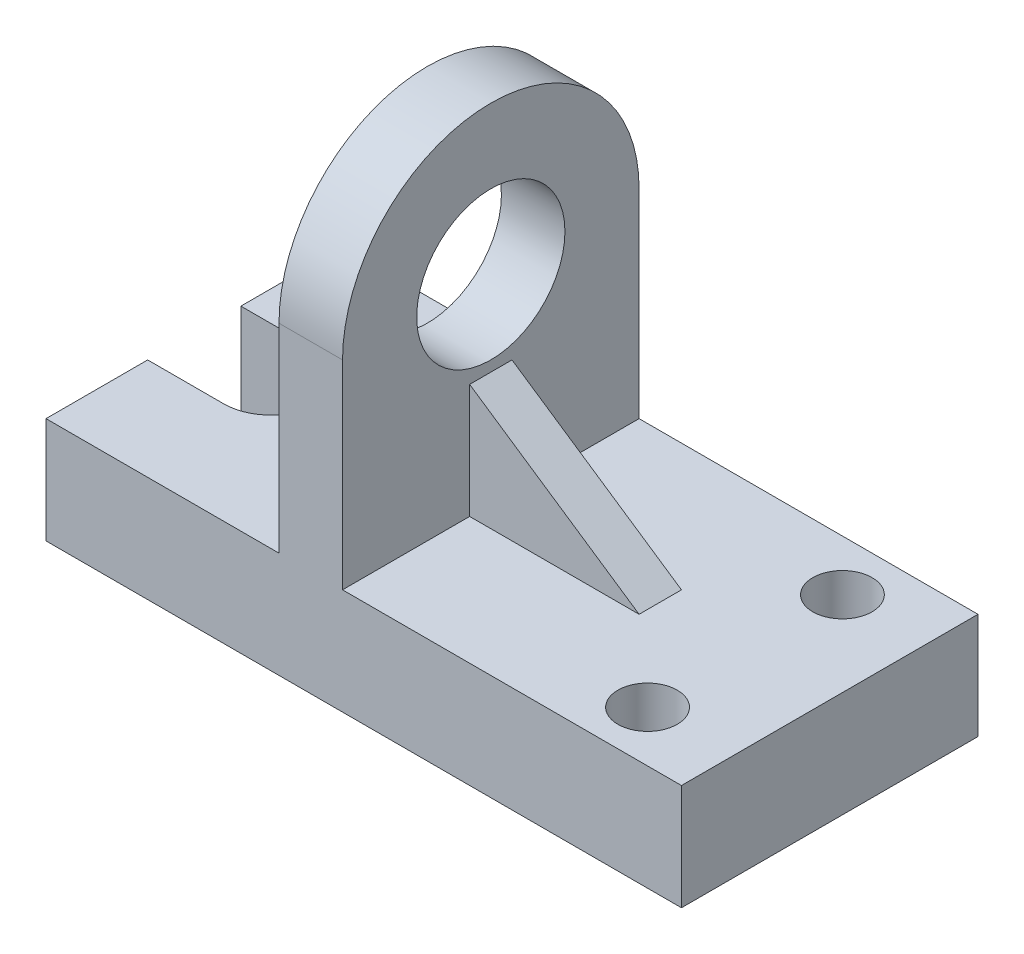
ISO-10303-21;
HEADER;
FILE_DESCRIPTION(('STEP AP214'),'2;1');
FILE_NAME('part.step','',(''),(''),'','','');
FILE_SCHEMA(('AUTOMOTIVE_DESIGN { 1 0 10303 214 1 1 1 1 }'));
ENDSEC;
DATA;
#1=APPLICATION_CONTEXT('core data for automotive mechanical design processes');
#2=APPLICATION_PROTOCOL_DEFINITION('international standard','automotive_design',2000,#1);
#3=PRODUCT_CONTEXT('',#1,'mechanical');
#4=PRODUCT('Part','Part','',(#3));
#5=PRODUCT_RELATED_PRODUCT_CATEGORY('part','',(#4));
#6=PRODUCT_DEFINITION_FORMATION('','',#4);
#7=PRODUCT_DEFINITION_CONTEXT('part definition',#1,'design');
#8=PRODUCT_DEFINITION('design','',#6,#7);
#9=PRODUCT_DEFINITION_SHAPE('','',#8);
#10=(LENGTH_UNIT() NAMED_UNIT(*) SI_UNIT(.MILLI.,.METRE.));
#11=(NAMED_UNIT(*) PLANE_ANGLE_UNIT() SI_UNIT($,.RADIAN.));
#12=(NAMED_UNIT(*) SI_UNIT($,.STERADIAN.) SOLID_ANGLE_UNIT());
#13=UNCERTAINTY_MEASURE_WITH_UNIT(LENGTH_MEASURE(1.E-05),#10,'distance_accuracy_value','');
#14=(GEOMETRIC_REPRESENTATION_CONTEXT(3) GLOBAL_UNCERTAINTY_ASSIGNED_CONTEXT((#13)) GLOBAL_UNIT_ASSIGNED_CONTEXT((#10,
#11,#12)) REPRESENTATION_CONTEXT('',''));
#15=CARTESIAN_POINT('',(0.,0.,0.));
#16=DIRECTION('',(0.,0.,1.));
#17=DIRECTION('',(1.,0.,0.));
#18=AXIS2_PLACEMENT_3D('',#15,#16,#17);
#19=CARTESIAN_POINT('',(0.,0.,70.));
#20=DIRECTION('',(0.,-1.,0.));
#21=DIRECTION('',(0.,0.,-1.));
#22=AXIS2_PLACEMENT_3D('',#19,#20,#21);
#23=PLANE('',#22);
#24=CARTESIAN_POINT('',(130.,0.,58.));
#25=DIRECTION('',(0.,1.,0.));
#26=DIRECTION('',(0.,0.,1.));
#27=AXIS2_PLACEMENT_3D('',#24,#25,#26);
#28=CIRCLE('',#27,7.00000000000002);
#29=CARTESIAN_POINT('',(130.,0.,65.));
#30=VERTEX_POINT('',#29);
#31=EDGE_CURVE('E244',#30,#30,#28,.F.);
#32=ORIENTED_EDGE('',*,*,#31,.T.);
#33=EDGE_LOOP('',(#32));
#34=FACE_BOUND('',#33,.T.);
#35=CARTESIAN_POINT('',(130.,0.,12.));
#36=DIRECTION('',(0.,1.,0.));
#37=DIRECTION('',(0.,0.,1.));
#38=AXIS2_PLACEMENT_3D('',#35,#36,#37);
#39=CIRCLE('',#38,7.00000000000001);
#40=CARTESIAN_POINT('',(130.,0.,19.));
#41=VERTEX_POINT('',#40);
#42=EDGE_CURVE('E251',#41,#41,#39,.T.);
#43=ORIENTED_EDGE('',*,*,#42,.F.);
#44=EDGE_LOOP('',(#43));
#45=FACE_BOUND('',#44,.T.);
#46=DIRECTION('',(0.,0.,-1.));
#47=VECTOR('',#46,1.);
#48=CARTESIAN_POINT('',(70.,0.,0.));
#49=LINE('',#48,#47);
#50=CARTESIAN_POINT('',(70.,0.,30.));
#51=VERTEX_POINT('',#50);
#52=CARTESIAN_POINT('',(70.,0.,0.));
#53=VERTEX_POINT('',#52);
#54=EDGE_CURVE('E38',#51,#53,#49,.T.);
#55=ORIENTED_EDGE('',*,*,#54,.F.);
#56=DIRECTION('',(-1.,0.,0.));
#57=VECTOR('',#56,1.);
#58=CARTESIAN_POINT('',(110.,0.,30.));
#59=LINE('',#58,#57);
#60=CARTESIAN_POINT('',(110.,0.,30.));
#61=VERTEX_POINT('',#60);
#62=EDGE_CURVE('E52',#61,#51,#59,.T.);
#63=ORIENTED_EDGE('',*,*,#62,.F.);
#64=DIRECTION('',(0.,0.,-1.));
#65=VECTOR('',#64,1.);
#66=CARTESIAN_POINT('',(110.,0.,35.));
#67=LINE('',#66,#65);
#68=CARTESIAN_POINT('',(110.,0.,40.));
#69=VERTEX_POINT('',#68);
#70=EDGE_CURVE('E56',#69,#61,#67,.T.);
#71=ORIENTED_EDGE('',*,*,#70,.F.);
#72=DIRECTION('',(-1.,0.,0.));
#73=VECTOR('',#72,1.);
#74=CARTESIAN_POINT('',(110.,0.,40.));
#75=LINE('',#74,#73);
#76=CARTESIAN_POINT('',(70.,0.,40.));
#77=VERTEX_POINT('',#76);
#78=EDGE_CURVE('E154',#69,#77,#75,.T.);
#79=ORIENTED_EDGE('',*,*,#78,.T.);
#80=CARTESIAN_POINT('',(70.,0.,70.));
#81=VERTEX_POINT('',#80);
#82=EDGE_CURVE('E143',#81,#77,#49,.T.);
#83=ORIENTED_EDGE('',*,*,#82,.F.);
#84=DIRECTION('',(-1.,0.,0.));
#85=VECTOR('',#84,1.);
#86=CARTESIAN_POINT('',(0.,0.,70.));
#87=LINE('',#86,#85);
#88=CARTESIAN_POINT('',(150.,0.,70.));
#89=VERTEX_POINT('',#88);
#90=EDGE_CURVE('E235',#89,#81,#87,.T.);
#91=ORIENTED_EDGE('',*,*,#90,.F.);
#92=DIRECTION('',(0.,0.,-1.));
#93=VECTOR('',#92,1.);
#94=CARTESIAN_POINT('',(150.,0.,70.));
#95=LINE('',#94,#93);
#96=CARTESIAN_POINT('',(150.,0.,0.));
#97=VERTEX_POINT('',#96);
#98=EDGE_CURVE('E215',#89,#97,#95,.T.);
#99=ORIENTED_EDGE('',*,*,#98,.T.);
#100=DIRECTION('',(-1.,0.,0.));
#101=VECTOR('',#100,1.);
#102=CARTESIAN_POINT('',(0.,0.,0.));
#103=LINE('',#102,#101);
#104=EDGE_CURVE('E222',#97,#53,#103,.T.);
#105=ORIENTED_EDGE('',*,*,#104,.T.);
#106=EDGE_LOOP('',(#55,#63,#71,#79,#83,#91,#99,#105));
#107=FACE_BOUND('',#106,.T.);
#108=ADVANCED_FACE('F34',(#34,#45,#107),#23,.F.);
#109=CARTESIAN_POINT('',(0.,0.,70.));
#110=DIRECTION('',(1.,0.,0.));
#111=DIRECTION('',(0.,0.,-1.));
#112=AXIS2_PLACEMENT_3D('',#109,#110,#111);
#113=PLANE('',#112);
#114=DIRECTION('',(0.,1.,0.));
#115=VECTOR('',#114,1.);
#116=CARTESIAN_POINT('',(0.,-25.,46.));
#117=LINE('',#116,#115);
#118=CARTESIAN_POINT('',(0.,-25.,46.));
#119=VERTEX_POINT('',#118);
#120=CARTESIAN_POINT('',(0.,0.,46.));
#121=VERTEX_POINT('',#120);
#122=EDGE_CURVE('E265',#119,#121,#117,.T.);
#123=ORIENTED_EDGE('',*,*,#122,.F.);
#124=DIRECTION('',(0.,0.,-1.));
#125=VECTOR('',#124,1.);
#126=CARTESIAN_POINT('',(0.,-25.,70.));
#127=LINE('',#126,#125);
#128=CARTESIAN_POINT('',(0.,-25.,70.));
#129=VERTEX_POINT('',#128);
#130=EDGE_CURVE('E12',#129,#119,#127,.T.);
#131=ORIENTED_EDGE('',*,*,#130,.F.);
#132=DIRECTION('',(0.,-1.,0.));
#133=VECTOR('',#132,1.);
#134=CARTESIAN_POINT('',(0.,0.,70.));
#135=LINE('',#134,#133);
#136=CARTESIAN_POINT('',(0.,0.,70.));
#137=VERTEX_POINT('',#136);
#138=EDGE_CURVE('E225',#137,#129,#135,.T.);
#139=ORIENTED_EDGE('',*,*,#138,.F.);
#140=DIRECTION('',(0.,0.,-1.));
#141=VECTOR('',#140,1.);
#142=CARTESIAN_POINT('',(0.,0.,70.));
#143=LINE('',#142,#141);
#144=EDGE_CURVE('E218',#137,#121,#143,.T.);
#145=ORIENTED_EDGE('',*,*,#144,.T.);
#146=EDGE_LOOP('',(#123,#131,#139,#145));
#147=FACE_BOUND('',#146,.T.);
#148=ADVANCED_FACE('F36',(#147),#113,.F.);
#149=DIRECTION('',(0.,1.,0.));
#150=VECTOR('',#149,1.);
#151=CARTESIAN_POINT('',(0.,-25.,24.));
#152=LINE('',#151,#150);
#153=CARTESIAN_POINT('',(0.,-25.,24.));
#154=VERTEX_POINT('',#153);
#155=CARTESIAN_POINT('',(0.,0.,24.));
#156=VERTEX_POINT('',#155);
#157=EDGE_CURVE('E261',#154,#156,#152,.T.);
#158=ORIENTED_EDGE('',*,*,#157,.T.);
#159=CARTESIAN_POINT('',(0.,0.,0.));
#160=VERTEX_POINT('',#159);
#161=EDGE_CURVE('E221',#156,#160,#143,.T.);
#162=ORIENTED_EDGE('',*,*,#161,.T.);
#163=DIRECTION('',(0.,-1.,0.));
#164=VECTOR('',#163,1.);
#165=CARTESIAN_POINT('',(0.,0.,0.));
#166=LINE('',#165,#164);
#167=CARTESIAN_POINT('',(0.,-25.,0.));
#168=VERTEX_POINT('',#167);
#169=EDGE_CURVE('E231',#160,#168,#166,.T.);
#170=ORIENTED_EDGE('',*,*,#169,.T.);
#171=EDGE_CURVE('E44',#154,#168,#127,.T.);
#172=ORIENTED_EDGE('',*,*,#171,.F.);
#173=EDGE_LOOP('',(#158,#162,#170,#172));
#174=FACE_BOUND('',#173,.T.);
#175=ADVANCED_FACE('F304',(#174),#113,.F.);
#176=CARTESIAN_POINT('',(0.,-25.,70.));
#177=DIRECTION('',(0.,1.,0.));
#178=DIRECTION('',(0.,0.,1.));
#179=AXIS2_PLACEMENT_3D('',#176,#177,#178);
#180=PLANE('',#179);
#181=DIRECTION('',(-1.,0.,0.));
#182=VECTOR('',#181,1.);
#183=CARTESIAN_POINT('',(0.,-25.,46.));
#184=LINE('',#183,#182);
#185=CARTESIAN_POINT('',(18.,-25.,46.));
#186=VERTEX_POINT('',#185);
#187=EDGE_CURVE('E262',#186,#119,#184,.T.);
#188=ORIENTED_EDGE('',*,*,#187,.F.);
#189=CARTESIAN_POINT('',(18.,-25.,35.));
#190=DIRECTION('',(0.,1.,0.));
#191=DIRECTION('',(0.,0.,1.));
#192=AXIS2_PLACEMENT_3D('',#189,#190,#191);
#193=CIRCLE('',#192,11.);
#194=CARTESIAN_POINT('',(18.,-25.,24.));
#195=VERTEX_POINT('',#194);
#196=EDGE_CURVE('E272',#195,#186,#193,.F.);
#197=ORIENTED_EDGE('',*,*,#196,.F.);
#198=DIRECTION('',(1.,0.,0.));
#199=VECTOR('',#198,1.);
#200=CARTESIAN_POINT('',(0.,-25.,24.));
#201=LINE('',#200,#199);
#202=EDGE_CURVE('E279',#154,#195,#201,.T.);
#203=ORIENTED_EDGE('',*,*,#202,.F.);
#204=ORIENTED_EDGE('',*,*,#171,.T.);
#205=DIRECTION('',(1.,0.,0.));
#206=VECTOR('',#205,1.);
#207=CARTESIAN_POINT('',(0.,-25.,0.));
#208=LINE('',#207,#206);
#209=CARTESIAN_POINT('',(150.,-25.,0.));
#210=VERTEX_POINT('',#209);
#211=EDGE_CURVE('E229',#168,#210,#208,.T.);
#212=ORIENTED_EDGE('',*,*,#211,.T.);
#213=DIRECTION('',(0.,0.,-1.));
#214=VECTOR('',#213,1.);
#215=CARTESIAN_POINT('',(150.,-25.,70.));
#216=LINE('',#215,#214);
#217=CARTESIAN_POINT('',(150.,-25.,70.));
#218=VERTEX_POINT('',#217);
#219=EDGE_CURVE('E212',#218,#210,#216,.T.);
#220=ORIENTED_EDGE('',*,*,#219,.F.);
#221=DIRECTION('',(1.,0.,0.));
#222=VECTOR('',#221,1.);
#223=CARTESIAN_POINT('',(0.,-25.,70.));
#224=LINE('',#223,#222);
#225=EDGE_CURVE('E240',#129,#218,#224,.T.);
#226=ORIENTED_EDGE('',*,*,#225,.F.);
#227=ORIENTED_EDGE('',*,*,#130,.T.);
#228=EDGE_LOOP('',(#188,#197,#203,#204,#212,#220,#226,#227));
#229=FACE_BOUND('',#228,.T.);
#230=CARTESIAN_POINT('',(130.,-25.,58.));
#231=DIRECTION('',(0.,1.,0.));
#232=DIRECTION('',(0.,0.,1.));
#233=AXIS2_PLACEMENT_3D('',#230,#231,#232);
#234=CIRCLE('',#233,7.00000000000002);
#235=CARTESIAN_POINT('',(130.,-25.,65.));
#236=VERTEX_POINT('',#235);
#237=EDGE_CURVE('E247',#236,#236,#234,.F.);
#238=ORIENTED_EDGE('',*,*,#237,.F.);
#239=EDGE_LOOP('',(#238));
#240=FACE_BOUND('',#239,.T.);
#241=CARTESIAN_POINT('',(130.,-25.,12.));
#242=DIRECTION('',(0.,1.,0.));
#243=DIRECTION('',(0.,0.,1.));
#244=AXIS2_PLACEMENT_3D('',#241,#242,#243);
#245=CIRCLE('',#244,7.00000000000001);
#246=CARTESIAN_POINT('',(130.,-25.,19.));
#247=VERTEX_POINT('',#246);
#248=EDGE_CURVE('E254',#247,#247,#245,.T.);
#249=ORIENTED_EDGE('',*,*,#248,.T.);
#250=EDGE_LOOP('',(#249));
#251=FACE_BOUND('',#250,.T.);
#252=ADVANCED_FACE('F320',(#229,#240,#251),#180,.F.);
#253=CARTESIAN_POINT('',(55.,0.,70.));
#254=VERTEX_POINT('',#253);
#255=EDGE_CURVE('E237',#254,#137,#87,.T.);
#256=ORIENTED_EDGE('',*,*,#255,.F.);
#257=DIRECTION('',(0.,0.,-1.));
#258=VECTOR('',#257,1.);
#259=CARTESIAN_POINT('',(55.,0.,0.));
#260=LINE('',#259,#258);
#261=CARTESIAN_POINT('',(55.,0.,0.));
#262=VERTEX_POINT('',#261);
#263=EDGE_CURVE('E195',#254,#262,#260,.T.);
#264=ORIENTED_EDGE('',*,*,#263,.T.);
#265=EDGE_CURVE('E226',#262,#160,#103,.T.);
#266=ORIENTED_EDGE('',*,*,#265,.T.);
#267=ORIENTED_EDGE('',*,*,#161,.F.);
#268=DIRECTION('',(1.,0.,0.));
#269=VECTOR('',#268,1.);
#270=CARTESIAN_POINT('',(0.,0.,24.));
#271=LINE('',#270,#269);
#272=CARTESIAN_POINT('',(18.,0.,24.));
#273=VERTEX_POINT('',#272);
#274=EDGE_CURVE('E273',#156,#273,#271,.T.);
#275=ORIENTED_EDGE('',*,*,#274,.T.);
#276=CARTESIAN_POINT('',(18.,0.,35.));
#277=DIRECTION('',(0.,1.,0.));
#278=DIRECTION('',(0.,0.,1.));
#279=AXIS2_PLACEMENT_3D('',#276,#277,#278);
#280=CIRCLE('',#279,11.);
#281=CARTESIAN_POINT('',(18.,0.,46.));
#282=VERTEX_POINT('',#281);
#283=EDGE_CURVE('E257',#273,#282,#280,.F.);
#284=ORIENTED_EDGE('',*,*,#283,.T.);
#285=DIRECTION('',(-1.,0.,0.));
#286=VECTOR('',#285,1.);
#287=CARTESIAN_POINT('',(0.,0.,46.));
#288=LINE('',#287,#286);
#289=EDGE_CURVE('E269',#282,#121,#288,.T.);
#290=ORIENTED_EDGE('',*,*,#289,.T.);
#291=ORIENTED_EDGE('',*,*,#144,.F.);
#292=EDGE_LOOP('',(#256,#264,#266,#267,#275,#284,#290,#291));
#293=FACE_BOUND('',#292,.T.);
#294=ADVANCED_FACE('F308',(#293),#23,.F.);
#295=CARTESIAN_POINT('',(150.,0.,70.));
#296=DIRECTION('',(-1.,0.,0.));
#297=DIRECTION('',(0.,0.,1.));
#298=AXIS2_PLACEMENT_3D('',#295,#296,#297);
#299=PLANE('',#298);
#300=DIRECTION('',(0.,1.,0.));
#301=VECTOR('',#300,1.);
#302=CARTESIAN_POINT('',(150.,0.,0.));
#303=LINE('',#302,#301);
#304=EDGE_CURVE('E227',#210,#97,#303,.T.);
#305=ORIENTED_EDGE('',*,*,#304,.T.);
#306=ORIENTED_EDGE('',*,*,#98,.F.);
#307=DIRECTION('',(0.,1.,0.));
#308=VECTOR('',#307,1.);
#309=CARTESIAN_POINT('',(150.,0.,70.));
#310=LINE('',#309,#308);
#311=EDGE_CURVE('E238',#218,#89,#310,.T.);
#312=ORIENTED_EDGE('',*,*,#311,.F.);
#313=ORIENTED_EDGE('',*,*,#219,.T.);
#314=EDGE_LOOP('',(#305,#306,#312,#313));
#315=FACE_BOUND('',#314,.T.);
#316=ADVANCED_FACE('F296',(#315),#299,.F.);
#317=CARTESIAN_POINT('',(0.,0.,70.));
#318=DIRECTION('',(0.,0.,1.));
#319=DIRECTION('',(1.,0.,0.));
#320=AXIS2_PLACEMENT_3D('',#317,#318,#319);
#321=PLANE('',#320);
#322=ORIENTED_EDGE('',*,*,#138,.T.);
#323=ORIENTED_EDGE('',*,*,#225,.T.);
#324=ORIENTED_EDGE('',*,*,#311,.T.);
#325=ORIENTED_EDGE('',*,*,#90,.T.);
#326=DIRECTION('',(0.,-1.,0.));
#327=VECTOR('',#326,1.);
#328=CARTESIAN_POINT('',(70.,0.,70.));
#329=LINE('',#328,#327);
#330=CARTESIAN_POINT('',(70.,47.,70.));
#331=VERTEX_POINT('',#330);
#332=EDGE_CURVE('E150',#331,#81,#329,.T.);
#333=ORIENTED_EDGE('',*,*,#332,.F.);
#334=DIRECTION('',(1.,0.,0.));
#335=VECTOR('',#334,1.);
#336=CARTESIAN_POINT('',(55.,47.,70.));
#337=LINE('',#336,#335);
#338=CARTESIAN_POINT('',(55.,47.,70.));
#339=VERTEX_POINT('',#338);
#340=EDGE_CURVE('E248',#339,#331,#337,.T.);
#341=ORIENTED_EDGE('',*,*,#340,.F.);
#342=DIRECTION('',(0.,-1.,0.));
#343=VECTOR('',#342,1.);
#344=CARTESIAN_POINT('',(55.,0.,70.));
#345=LINE('',#344,#343);
#346=EDGE_CURVE('E204',#339,#254,#345,.T.);
#347=ORIENTED_EDGE('',*,*,#346,.T.);
#348=ORIENTED_EDGE('',*,*,#255,.T.);
#349=EDGE_LOOP('',(#322,#323,#324,#325,#333,#341,#347,#348));
#350=FACE_BOUND('',#349,.T.);
#351=ADVANCED_FACE('F316',(#350),#321,.T.);
#352=CARTESIAN_POINT('',(0.,0.,0.));
#353=DIRECTION('',(0.,0.,1.));
#354=DIRECTION('',(1.,0.,0.));
#355=AXIS2_PLACEMENT_3D('',#352,#353,#354);
#356=PLANE('',#355);
#357=ORIENTED_EDGE('',*,*,#169,.F.);
#358=ORIENTED_EDGE('',*,*,#265,.F.);
#359=DIRECTION('',(0.,1.,0.));
#360=VECTOR('',#359,1.);
#361=CARTESIAN_POINT('',(55.,47.,0.));
#362=LINE('',#361,#360);
#363=CARTESIAN_POINT('',(55.,47.,0.));
#364=VERTEX_POINT('',#363);
#365=EDGE_CURVE('E198',#262,#364,#362,.T.);
#366=ORIENTED_EDGE('',*,*,#365,.T.);
#367=DIRECTION('',(1.,0.,0.));
#368=VECTOR('',#367,1.);
#369=CARTESIAN_POINT('',(55.,47.,0.));
#370=LINE('',#369,#368);
#371=CARTESIAN_POINT('',(70.,47.,0.));
#372=VERTEX_POINT('',#371);
#373=EDGE_CURVE('E206',#364,#372,#370,.T.);
#374=ORIENTED_EDGE('',*,*,#373,.T.);
#375=DIRECTION('',(0.,1.,0.));
#376=VECTOR('',#375,1.);
#377=CARTESIAN_POINT('',(70.,47.,0.));
#378=LINE('',#377,#376);
#379=EDGE_CURVE('E153',#53,#372,#378,.T.);
#380=ORIENTED_EDGE('',*,*,#379,.F.);
#381=ORIENTED_EDGE('',*,*,#104,.F.);
#382=ORIENTED_EDGE('',*,*,#304,.F.);
#383=ORIENTED_EDGE('',*,*,#211,.F.);
#384=EDGE_LOOP('',(#357,#358,#366,#374,#380,#381,#382,#383));
#385=FACE_BOUND('',#384,.T.);
#386=ADVANCED_FACE('F291',(#385),#356,.F.);
#387=CARTESIAN_POINT('',(130.,-25.,58.));
#388=DIRECTION('',(0.,1.,0.));
#389=DIRECTION('',(0.,0.,1.));
#390=AXIS2_PLACEMENT_3D('',#387,#388,#389);
#391=CYLINDRICAL_SURFACE('',#390,7.00000000000002);
#392=ORIENTED_EDGE('',*,*,#237,.T.);
#393=EDGE_LOOP('',(#392));
#394=FACE_BOUND('',#393,.T.);
#395=ORIENTED_EDGE('',*,*,#31,.F.);
#396=EDGE_LOOP('',(#395));
#397=FACE_BOUND('',#396,.T.);
#398=ADVANCED_FACE('F332',(#394,#397),#391,.F.);
#399=CARTESIAN_POINT('',(130.,-25.,12.));
#400=DIRECTION('',(0.,1.,0.));
#401=DIRECTION('',(0.,0.,1.));
#402=AXIS2_PLACEMENT_3D('',#399,#400,#401);
#403=CYLINDRICAL_SURFACE('',#402,7.00000000000001);
#404=ORIENTED_EDGE('',*,*,#248,.F.);
#405=EDGE_LOOP('',(#404));
#406=FACE_BOUND('',#405,.T.);
#407=ORIENTED_EDGE('',*,*,#42,.T.);
#408=EDGE_LOOP('',(#407));
#409=FACE_BOUND('',#408,.T.);
#410=ADVANCED_FACE('F328',(#406,#409),#403,.F.);
#411=CARTESIAN_POINT('',(18.,-25.,35.));
#412=DIRECTION('',(0.,1.,0.));
#413=DIRECTION('',(0.,0.,1.));
#414=AXIS2_PLACEMENT_3D('',#411,#412,#413);
#415=CYLINDRICAL_SURFACE('',#414,11.);
#416=ORIENTED_EDGE('',*,*,#283,.F.);
#417=DIRECTION('',(0.,1.,0.));
#418=VECTOR('',#417,1.);
#419=CARTESIAN_POINT('',(18.,-25.,24.));
#420=LINE('',#419,#418);
#421=EDGE_CURVE('E258',#195,#273,#420,.T.);
#422=ORIENTED_EDGE('',*,*,#421,.F.);
#423=ORIENTED_EDGE('',*,*,#196,.T.);
#424=DIRECTION('',(0.,1.,0.));
#425=VECTOR('',#424,1.);
#426=CARTESIAN_POINT('',(18.,-25.,46.));
#427=LINE('',#426,#425);
#428=EDGE_CURVE('E234',#186,#282,#427,.T.);
#429=ORIENTED_EDGE('',*,*,#428,.T.);
#430=EDGE_LOOP('',(#416,#422,#423,#429));
#431=FACE_BOUND('',#430,.T.);
#432=ADVANCED_FACE('F331',(#431),#415,.F.);
#433=CARTESIAN_POINT('',(0.,-25.,46.));
#434=DIRECTION('',(0.,0.,-1.));
#435=DIRECTION('',(-1.,0.,0.));
#436=AXIS2_PLACEMENT_3D('',#433,#434,#435);
#437=PLANE('',#436);
#438=ORIENTED_EDGE('',*,*,#289,.F.);
#439=ORIENTED_EDGE('',*,*,#428,.F.);
#440=ORIENTED_EDGE('',*,*,#187,.T.);
#441=ORIENTED_EDGE('',*,*,#122,.T.);
#442=EDGE_LOOP('',(#438,#439,#440,#441));
#443=FACE_BOUND('',#442,.T.);
#444=ADVANCED_FACE('F362',(#443),#437,.T.);
#445=CARTESIAN_POINT('',(0.,-25.,24.));
#446=DIRECTION('',(0.,0.,1.));
#447=DIRECTION('',(1.,0.,0.));
#448=AXIS2_PLACEMENT_3D('',#445,#446,#447);
#449=PLANE('',#448);
#450=ORIENTED_EDGE('',*,*,#274,.F.);
#451=ORIENTED_EDGE('',*,*,#157,.F.);
#452=ORIENTED_EDGE('',*,*,#202,.T.);
#453=ORIENTED_EDGE('',*,*,#421,.T.);
#454=EDGE_LOOP('',(#450,#451,#452,#453));
#455=FACE_BOUND('',#454,.T.);
#456=ADVANCED_FACE('F364',(#455),#449,.T.);
#457=CARTESIAN_POINT('',(55.,47.,35.));
#458=DIRECTION('',(1.,0.,0.));
#459=DIRECTION('',(0.,0.,-1.));
#460=AXIS2_PLACEMENT_3D('',#457,#458,#459);
#461=CYLINDRICAL_SURFACE('',#460,35.);
#462=CARTESIAN_POINT('',(70.,47.,35.));
#463=DIRECTION('',(1.,0.,0.));
#464=DIRECTION('',(0.,0.,1.));
#465=AXIS2_PLACEMENT_3D('',#462,#463,#464);
#466=CIRCLE('',#465,35.);
#467=EDGE_CURVE('E284',#372,#331,#466,.T.);
#468=ORIENTED_EDGE('',*,*,#467,.F.);
#469=ORIENTED_EDGE('',*,*,#373,.F.);
#470=CARTESIAN_POINT('',(55.,47.,35.));
#471=DIRECTION('',(1.,0.,0.));
#472=DIRECTION('',(0.,0.,1.));
#473=AXIS2_PLACEMENT_3D('',#470,#471,#472);
#474=CIRCLE('',#473,35.);
#475=EDGE_CURVE('E201',#364,#339,#474,.T.);
#476=ORIENTED_EDGE('',*,*,#475,.T.);
#477=ORIENTED_EDGE('',*,*,#340,.T.);
#478=EDGE_LOOP('',(#468,#469,#476,#477));
#479=FACE_BOUND('',#478,.T.);
#480=ADVANCED_FACE('F314',(#479),#461,.T.);
#481=CARTESIAN_POINT('',(55.,47.,35.));
#482=DIRECTION('',(-1.,0.,0.));
#483=DIRECTION('',(0.,0.,1.));
#484=AXIS2_PLACEMENT_3D('',#481,#482,#483);
#485=PLANE('',#484);
#486=CARTESIAN_POINT('',(55.,47.,35.));
#487=DIRECTION('',(1.,0.,0.));
#488=DIRECTION('',(0.,0.,-1.));
#489=AXIS2_PLACEMENT_3D('',#486,#487,#488);
#490=CIRCLE('',#489,17.5);
#491=CARTESIAN_POINT('',(55.,47.,17.5));
#492=VERTEX_POINT('',#491);
#493=EDGE_CURVE('E190',#492,#492,#490,.T.);
#494=ORIENTED_EDGE('',*,*,#493,.T.);
#495=EDGE_LOOP('',(#494));
#496=FACE_BOUND('',#495,.T.);
#497=ORIENTED_EDGE('',*,*,#263,.F.);
#498=ORIENTED_EDGE('',*,*,#346,.F.);
#499=ORIENTED_EDGE('',*,*,#475,.F.);
#500=ORIENTED_EDGE('',*,*,#365,.F.);
#501=EDGE_LOOP('',(#497,#498,#499,#500));
#502=FACE_BOUND('',#501,.T.);
#503=ADVANCED_FACE('F311',(#496,#502),#485,.T.);
#504=CARTESIAN_POINT('',(70.,47.,35.));
#505=DIRECTION('',(-1.,0.,0.));
#506=DIRECTION('',(0.,0.,1.));
#507=AXIS2_PLACEMENT_3D('',#504,#505,#506);
#508=PLANE('',#507);
#509=CARTESIAN_POINT('',(70.,47.,35.));
#510=DIRECTION('',(1.,0.,0.));
#511=DIRECTION('',(0.,0.,-1.));
#512=AXIS2_PLACEMENT_3D('',#509,#510,#511);
#513=CIRCLE('',#512,17.5);
#514=CARTESIAN_POINT('',(70.,47.,17.5));
#515=VERTEX_POINT('',#514);
#516=EDGE_CURVE('E181',#515,#515,#513,.T.);
#517=ORIENTED_EDGE('',*,*,#516,.F.);
#518=EDGE_LOOP('',(#517));
#519=FACE_BOUND('',#518,.T.);
#520=DIRECTION('',(0.,0.,-1.));
#521=VECTOR('',#520,1.);
#522=CARTESIAN_POINT('',(70.,27.,35.));
#523=LINE('',#522,#521);
#524=CARTESIAN_POINT('',(70.,27.,40.));
#525=VERTEX_POINT('',#524);
#526=CARTESIAN_POINT('',(70.,27.,30.));
#527=VERTEX_POINT('',#526);
#528=EDGE_CURVE('E170',#525,#527,#523,.T.);
#529=ORIENTED_EDGE('',*,*,#528,.T.);
#530=DIRECTION('',(0.,-1.,0.));
#531=VECTOR('',#530,1.);
#532=CARTESIAN_POINT('',(70.,27.,30.));
#533=LINE('',#532,#531);
#534=EDGE_CURVE('E172',#527,#51,#533,.T.);
#535=ORIENTED_EDGE('',*,*,#534,.T.);
#536=ORIENTED_EDGE('',*,*,#54,.T.);
#537=ORIENTED_EDGE('',*,*,#379,.T.);
#538=ORIENTED_EDGE('',*,*,#467,.T.);
#539=ORIENTED_EDGE('',*,*,#332,.T.);
#540=ORIENTED_EDGE('',*,*,#82,.T.);
#541=DIRECTION('',(0.,-1.,0.));
#542=VECTOR('',#541,1.);
#543=CARTESIAN_POINT('',(70.,27.,40.));
#544=LINE('',#543,#542);
#545=EDGE_CURVE('E146',#525,#77,#544,.T.);
#546=ORIENTED_EDGE('',*,*,#545,.F.);
#547=EDGE_LOOP('',(#529,#535,#536,#537,#538,#539,#540,#546));
#548=FACE_BOUND('',#547,.T.);
#549=ADVANCED_FACE('F144',(#519,#548),#508,.F.);
#550=CARTESIAN_POINT('',(55.,47.,35.));
#551=DIRECTION('',(1.,0.,0.));
#552=DIRECTION('',(0.,0.,-1.));
#553=AXIS2_PLACEMENT_3D('',#550,#551,#552);
#554=CYLINDRICAL_SURFACE('',#553,17.5);
#555=ORIENTED_EDGE('',*,*,#493,.F.);
#556=EDGE_LOOP('',(#555));
#557=FACE_BOUND('',#556,.T.);
#558=ORIENTED_EDGE('',*,*,#516,.T.);
#559=EDGE_LOOP('',(#558));
#560=FACE_BOUND('',#559,.T.);
#561=ADVANCED_FACE('F375',(#557,#560),#554,.F.);
#562=CARTESIAN_POINT('',(0.,0.,30.));
#563=DIRECTION('',(0.,0.,-1.));
#564=DIRECTION('',(-1.,0.,0.));
#565=AXIS2_PLACEMENT_3D('',#562,#563,#564);
#566=PLANE('',#565);
#567=ORIENTED_EDGE('',*,*,#534,.F.);
#568=DIRECTION('',(0.828848674075648,-0.559472855001062,0.));
#569=VECTOR('',#568,1.);
#570=CARTESIAN_POINT('',(70.,27.,30.));
#571=LINE('',#570,#569);
#572=EDGE_CURVE('E176',#527,#61,#571,.T.);
#573=ORIENTED_EDGE('',*,*,#572,.T.);
#574=ORIENTED_EDGE('',*,*,#62,.T.);
#575=EDGE_LOOP('',(#567,#573,#574));
#576=FACE_BOUND('',#575,.T.);
#577=ADVANCED_FACE('F382',(#576),#566,.T.);
#578=CARTESIAN_POINT('',(70.,27.,35.));
#579=DIRECTION('',(0.559472855001062,0.828848674075648,0.));
#580=DIRECTION('',(-0.828848674075648,0.559472855001062,0.));
#581=AXIS2_PLACEMENT_3D('',#578,#579,#580);
#582=PLANE('',#581);
#583=ORIENTED_EDGE('',*,*,#572,.F.);
#584=ORIENTED_EDGE('',*,*,#528,.F.);
#585=DIRECTION('',(0.828848674075648,-0.559472855001062,0.));
#586=VECTOR('',#585,1.);
#587=CARTESIAN_POINT('',(70.,27.,40.));
#588=LINE('',#587,#586);
#589=EDGE_CURVE('E158',#525,#69,#588,.T.);
#590=ORIENTED_EDGE('',*,*,#589,.T.);
#591=ORIENTED_EDGE('',*,*,#70,.T.);
#592=EDGE_LOOP('',(#583,#584,#590,#591));
#593=FACE_BOUND('',#592,.T.);
#594=ADVANCED_FACE('F384',(#593),#582,.T.);
#595=CARTESIAN_POINT('',(0.,0.,40.));
#596=DIRECTION('',(0.,0.,-1.));
#597=DIRECTION('',(-1.,0.,0.));
#598=AXIS2_PLACEMENT_3D('',#595,#596,#597);
#599=PLANE('',#598);
#600=ORIENTED_EDGE('',*,*,#545,.T.);
#601=ORIENTED_EDGE('',*,*,#78,.F.);
#602=ORIENTED_EDGE('',*,*,#589,.F.);
#603=EDGE_LOOP('',(#600,#601,#602));
#604=FACE_BOUND('',#603,.T.);
#605=ADVANCED_FACE('F160',(#604),#599,.F.);
#606=CLOSED_SHELL('',(#108,#148,#175,#252,#294,#316,#351,#386,#398,#410,#432,#444,#456,#480,
#503,#549,#561,#577,#594,#605));
#607=MANIFOLD_SOLID_BREP('B2',#606);
#608=ADVANCED_BREP_SHAPE_REPRESENTATION('',(#18,#607),#14);
#609=SHAPE_DEFINITION_REPRESENTATION(#9,#608);
ENDSEC;
END-ISO-10303-21;
